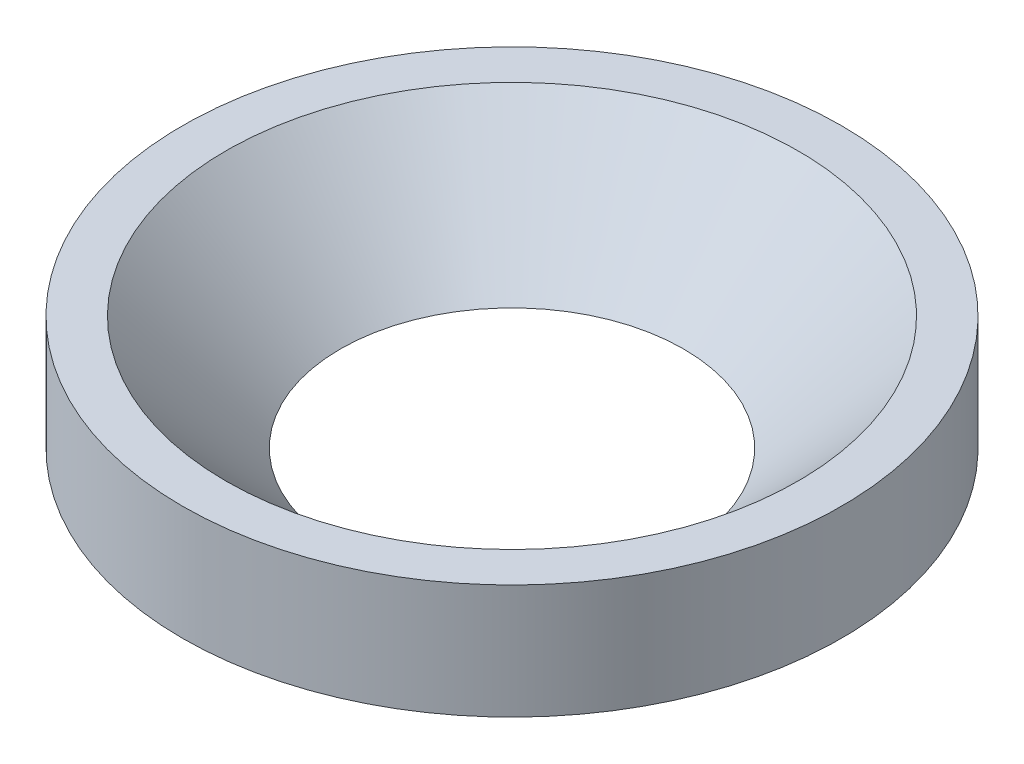
ISO-10303-21;
HEADER;
FILE_DESCRIPTION(('STEP AP214'),'2;1');
FILE_NAME('part.step','',(''),(''),'','','');
FILE_SCHEMA(('AUTOMOTIVE_DESIGN { 1 0 10303 214 1 1 1 1 }'));
ENDSEC;
DATA;
#1=APPLICATION_CONTEXT('core data for automotive mechanical design processes');
#2=APPLICATION_PROTOCOL_DEFINITION('international standard','automotive_design',2000,#1);
#3=PRODUCT_CONTEXT('',#1,'mechanical');
#4=PRODUCT('Part','Part','',(#3));
#5=PRODUCT_RELATED_PRODUCT_CATEGORY('part','',(#4));
#6=PRODUCT_DEFINITION_FORMATION('','',#4);
#7=PRODUCT_DEFINITION_CONTEXT('part definition',#1,'design');
#8=PRODUCT_DEFINITION('design','',#6,#7);
#9=PRODUCT_DEFINITION_SHAPE('','',#8);
#10=(LENGTH_UNIT() NAMED_UNIT(*) SI_UNIT(.MILLI.,.METRE.));
#11=(NAMED_UNIT(*) PLANE_ANGLE_UNIT() SI_UNIT($,.RADIAN.));
#12=(NAMED_UNIT(*) SI_UNIT($,.STERADIAN.) SOLID_ANGLE_UNIT());
#13=UNCERTAINTY_MEASURE_WITH_UNIT(LENGTH_MEASURE(1.E-05),#10,'distance_accuracy_value','');
#14=(GEOMETRIC_REPRESENTATION_CONTEXT(3) GLOBAL_UNCERTAINTY_ASSIGNED_CONTEXT((#13)) GLOBAL_UNIT_ASSIGNED_CONTEXT((#10,
#11,#12)) REPRESENTATION_CONTEXT('',''));
#15=CARTESIAN_POINT('',(0.,0.,0.));
#16=DIRECTION('',(0.,0.,1.));
#17=DIRECTION('',(1.,0.,0.));
#18=AXIS2_PLACEMENT_3D('',#15,#16,#17);
#19=CARTESIAN_POINT('',(0.,2.,0.));
#20=DIRECTION('',(0.,1.,0.));
#21=DIRECTION('',(0.,0.,1.));
#22=AXIS2_PLACEMENT_3D('',#19,#20,#21);
#23=PLANE('',#22);
#24=CARTESIAN_POINT('',(0.,2.,0.));
#25=DIRECTION('',(0.,1.,0.));
#26=DIRECTION('',(0.,0.,1.));
#27=AXIS2_PLACEMENT_3D('',#24,#25,#26);
#28=CIRCLE('',#27,5.00000000000001);
#29=CARTESIAN_POINT('',(0.,2.,5.00000000000001));
#30=VERTEX_POINT('',#29);
#31=EDGE_CURVE('E10',#30,#30,#28,.F.);
#32=ORIENTED_EDGE('',*,*,#31,.T.);
#33=EDGE_LOOP('',(#32));
#34=FACE_BOUND('',#33,.T.);
#35=CARTESIAN_POINT('',(0.,2.,0.));
#36=DIRECTION('',(0.,1.,0.));
#37=DIRECTION('',(0.,0.,1.));
#38=AXIS2_PLACEMENT_3D('',#35,#36,#37);
#39=CIRCLE('',#38,5.76);
#40=CARTESIAN_POINT('',(0.,2.,5.76));
#41=VERTEX_POINT('',#40);
#42=EDGE_CURVE('E41',#41,#41,#39,.T.);
#43=ORIENTED_EDGE('',*,*,#42,.T.);
#44=EDGE_LOOP('',(#43));
#45=FACE_BOUND('',#44,.T.);
#46=ADVANCED_FACE('F33',(#34,#45),#23,.T.);
#47=CARTESIAN_POINT('',(0.,0.,0.));
#48=DIRECTION('',(0.,1.,0.));
#49=DIRECTION('',(0.,0.,1.));
#50=AXIS2_PLACEMENT_3D('',#47,#48,#49);
#51=PLANE('',#50);
#52=CARTESIAN_POINT('',(0.,0.,0.));
#53=DIRECTION('',(0.,1.,0.));
#54=DIRECTION('',(0.,0.,1.));
#55=AXIS2_PLACEMENT_3D('',#52,#53,#54);
#56=CIRCLE('',#55,5.76);
#57=CARTESIAN_POINT('',(0.,0.,5.76));
#58=VERTEX_POINT('',#57);
#59=EDGE_CURVE('E45',#58,#58,#56,.T.);
#60=ORIENTED_EDGE('',*,*,#59,.F.);
#61=EDGE_LOOP('',(#60));
#62=FACE_BOUND('',#61,.T.);
#63=CARTESIAN_POINT('',(0.,0.,0.));
#64=DIRECTION('',(0.,1.,0.));
#65=DIRECTION('',(0.,0.,1.));
#66=AXIS2_PLACEMENT_3D('',#63,#64,#65);
#67=CIRCLE('',#66,3.);
#68=CARTESIAN_POINT('',(0.,0.,3.));
#69=VERTEX_POINT('',#68);
#70=EDGE_CURVE('E50',#69,#69,#67,.T.);
#71=ORIENTED_EDGE('',*,*,#70,.T.);
#72=EDGE_LOOP('',(#71));
#73=FACE_BOUND('',#72,.T.);
#74=ADVANCED_FACE('F55',(#62,#73),#51,.F.);
#75=CARTESIAN_POINT('',(0.,2.,0.));
#76=DIRECTION('',(0.,-1.,0.));
#77=DIRECTION('',(0.,0.,-1.));
#78=AXIS2_PLACEMENT_3D('',#75,#76,#77);
#79=CYLINDRICAL_SURFACE('',#78,5.76);
#80=ORIENTED_EDGE('',*,*,#42,.F.);
#81=EDGE_LOOP('',(#80));
#82=FACE_BOUND('',#81,.T.);
#83=ORIENTED_EDGE('',*,*,#59,.T.);
#84=EDGE_LOOP('',(#83));
#85=FACE_BOUND('',#84,.T.);
#86=ADVANCED_FACE('F58',(#82,#85),#79,.T.);
#87=CARTESIAN_POINT('',(0.,0.,0.));
#88=DIRECTION('',(0.,1.,0.));
#89=DIRECTION('',(0.,0.,1.));
#90=AXIS2_PLACEMENT_3D('',#87,#88,#89);
#91=CONICAL_SURFACE('',#90,3.,0.785398163397449);
#92=ORIENTED_EDGE('',*,*,#31,.F.);
#93=EDGE_LOOP('',(#92));
#94=FACE_BOUND('',#93,.T.);
#95=ORIENTED_EDGE('',*,*,#70,.F.);
#96=EDGE_LOOP('',(#95));
#97=FACE_BOUND('',#96,.T.);
#98=ADVANCED_FACE('F36',(#94,#97),#91,.F.);
#99=CLOSED_SHELL('',(#46,#74,#86,#98));
#100=MANIFOLD_SOLID_BREP('B2',#99);
#101=ADVANCED_BREP_SHAPE_REPRESENTATION('',(#18,#100),#14);
#102=SHAPE_DEFINITION_REPRESENTATION(#9,#101);
ENDSEC;
END-ISO-10303-21;
